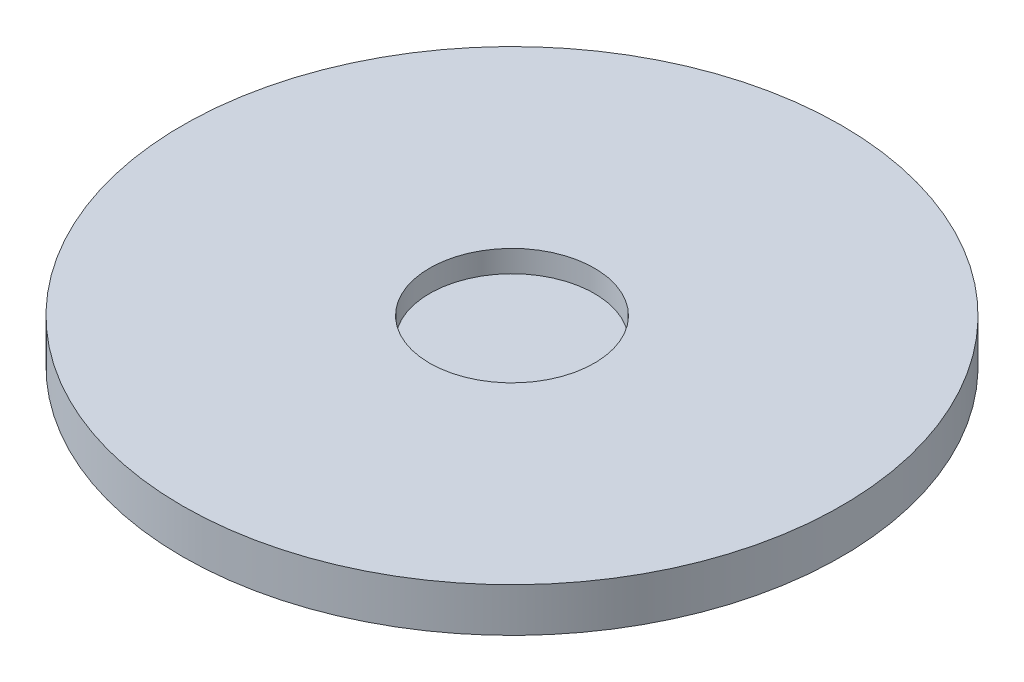
ISO-10303-21;
HEADER;
FILE_DESCRIPTION(('STEP AP214'),'2;1');
FILE_NAME('part.step','',(''),(''),'','','');
FILE_SCHEMA(('AUTOMOTIVE_DESIGN { 1 0 10303 214 1 1 1 1 }'));
ENDSEC;
DATA;
#1=APPLICATION_CONTEXT('core data for automotive mechanical design processes');
#2=APPLICATION_PROTOCOL_DEFINITION('international standard','automotive_design',2000,#1);
#3=PRODUCT_CONTEXT('',#1,'mechanical');
#4=PRODUCT('Part','Part','',(#3));
#5=PRODUCT_RELATED_PRODUCT_CATEGORY('part','',(#4));
#6=PRODUCT_DEFINITION_FORMATION('','',#4);
#7=PRODUCT_DEFINITION_CONTEXT('part definition',#1,'design');
#8=PRODUCT_DEFINITION('design','',#6,#7);
#9=PRODUCT_DEFINITION_SHAPE('','',#8);
#10=(LENGTH_UNIT() NAMED_UNIT(*) SI_UNIT(.MILLI.,.METRE.));
#11=(NAMED_UNIT(*) PLANE_ANGLE_UNIT() SI_UNIT($,.RADIAN.));
#12=(NAMED_UNIT(*) SI_UNIT($,.STERADIAN.) SOLID_ANGLE_UNIT());
#13=UNCERTAINTY_MEASURE_WITH_UNIT(LENGTH_MEASURE(1.E-05),#10,'distance_accuracy_value','');
#14=(GEOMETRIC_REPRESENTATION_CONTEXT(3) GLOBAL_UNCERTAINTY_ASSIGNED_CONTEXT((#13)) GLOBAL_UNIT_ASSIGNED_CONTEXT((#10,
#11,#12)) REPRESENTATION_CONTEXT('',''));
#15=CARTESIAN_POINT('',(0.,0.,0.));
#16=DIRECTION('',(0.,0.,1.));
#17=DIRECTION('',(1.,0.,0.));
#18=AXIS2_PLACEMENT_3D('',#15,#16,#17);
#19=CARTESIAN_POINT('',(0.,20.,0.));
#20=DIRECTION('',(0.,-1.,0.));
#21=DIRECTION('',(0.,0.,-1.));
#22=AXIS2_PLACEMENT_3D('',#19,#20,#21);
#23=CYLINDRICAL_SURFACE('',#22,150.);
#24=CARTESIAN_POINT('',(0.,20.,0.));
#25=DIRECTION('',(0.,1.,0.));
#26=DIRECTION('',(0.,0.,1.));
#27=AXIS2_PLACEMENT_3D('',#24,#25,#26);
#28=CIRCLE('',#27,150.);
#29=CARTESIAN_POINT('',(0.,20.,150.));
#30=VERTEX_POINT('',#29);
#31=EDGE_CURVE('E10',#30,#30,#28,.T.);
#32=ORIENTED_EDGE('',*,*,#31,.F.);
#33=EDGE_LOOP('',(#32));
#34=FACE_BOUND('',#33,.T.);
#35=CARTESIAN_POINT('',(0.,0.,0.));
#36=DIRECTION('',(0.,1.,0.));
#37=DIRECTION('',(0.,0.,1.));
#38=AXIS2_PLACEMENT_3D('',#35,#36,#37);
#39=CIRCLE('',#38,150.);
#40=CARTESIAN_POINT('',(0.,0.,150.));
#41=VERTEX_POINT('',#40);
#42=EDGE_CURVE('E43',#41,#41,#39,.T.);
#43=ORIENTED_EDGE('',*,*,#42,.T.);
#44=EDGE_LOOP('',(#43));
#45=FACE_BOUND('',#44,.T.);
#46=ADVANCED_FACE('F40',(#34,#45),#23,.T.);
#47=CARTESIAN_POINT('',(0.,20.,0.));
#48=DIRECTION('',(0.,1.,0.));
#49=DIRECTION('',(0.,0.,1.));
#50=AXIS2_PLACEMENT_3D('',#47,#48,#49);
#51=PLANE('',#50);
#52=CARTESIAN_POINT('',(0.,20.,0.));
#53=DIRECTION('',(0.,1.,0.));
#54=DIRECTION('',(0.,0.,1.));
#55=AXIS2_PLACEMENT_3D('',#52,#53,#54);
#56=CIRCLE('',#55,37.5);
#57=CARTESIAN_POINT('',(0.,20.,37.5));
#58=VERTEX_POINT('',#57);
#59=EDGE_CURVE('E52',#58,#58,#56,.T.);
#60=ORIENTED_EDGE('',*,*,#59,.F.);
#61=EDGE_LOOP('',(#60));
#62=FACE_BOUND('',#61,.T.);
#63=ORIENTED_EDGE('',*,*,#31,.T.);
#64=EDGE_LOOP('',(#63));
#65=FACE_BOUND('',#64,.T.);
#66=ADVANCED_FACE('F67',(#62,#65),#51,.T.);
#67=CARTESIAN_POINT('',(0.,0.,0.));
#68=DIRECTION('',(0.,1.,0.));
#69=DIRECTION('',(0.,0.,1.));
#70=AXIS2_PLACEMENT_3D('',#67,#68,#69);
#71=PLANE('',#70);
#72=ORIENTED_EDGE('',*,*,#42,.F.);
#73=EDGE_LOOP('',(#72));
#74=FACE_BOUND('',#73,.T.);
#75=ADVANCED_FACE('F63',(#74),#71,.F.);
#76=CARTESIAN_POINT('',(0.,10.,0.));
#77=DIRECTION('',(0.,1.,0.));
#78=DIRECTION('',(0.,0.,1.));
#79=AXIS2_PLACEMENT_3D('',#76,#77,#78);
#80=CYLINDRICAL_SURFACE('',#79,37.5);
#81=CARTESIAN_POINT('',(0.,10.,0.));
#82=DIRECTION('',(0.,1.,0.));
#83=DIRECTION('',(0.,0.,1.));
#84=AXIS2_PLACEMENT_3D('',#81,#82,#83);
#85=CIRCLE('',#84,37.5);
#86=CARTESIAN_POINT('',(0.,10.,37.5));
#87=VERTEX_POINT('',#86);
#88=EDGE_CURVE('E50',#87,#87,#85,.T.);
#89=ORIENTED_EDGE('',*,*,#88,.F.);
#90=EDGE_LOOP('',(#89));
#91=FACE_BOUND('',#90,.T.);
#92=ORIENTED_EDGE('',*,*,#59,.T.);
#93=EDGE_LOOP('',(#92));
#94=FACE_BOUND('',#93,.T.);
#95=ADVANCED_FACE('F60',(#91,#94),#80,.F.);
#96=CARTESIAN_POINT('',(0.,10.,0.));
#97=DIRECTION('',(0.,1.,0.));
#98=DIRECTION('',(0.,0.,1.));
#99=AXIS2_PLACEMENT_3D('',#96,#97,#98);
#100=PLANE('',#99);
#101=ORIENTED_EDGE('',*,*,#88,.T.);
#102=EDGE_LOOP('',(#101));
#103=FACE_BOUND('',#102,.T.);
#104=ADVANCED_FACE('F58',(#103),#100,.T.);
#105=CLOSED_SHELL('',(#46,#66,#75,#95,#104));
#106=MANIFOLD_SOLID_BREP('B2',#105);
#107=ADVANCED_BREP_SHAPE_REPRESENTATION('',(#18,#106),#14);
#108=SHAPE_DEFINITION_REPRESENTATION(#9,#107);
ENDSEC;
END-ISO-10303-21;
